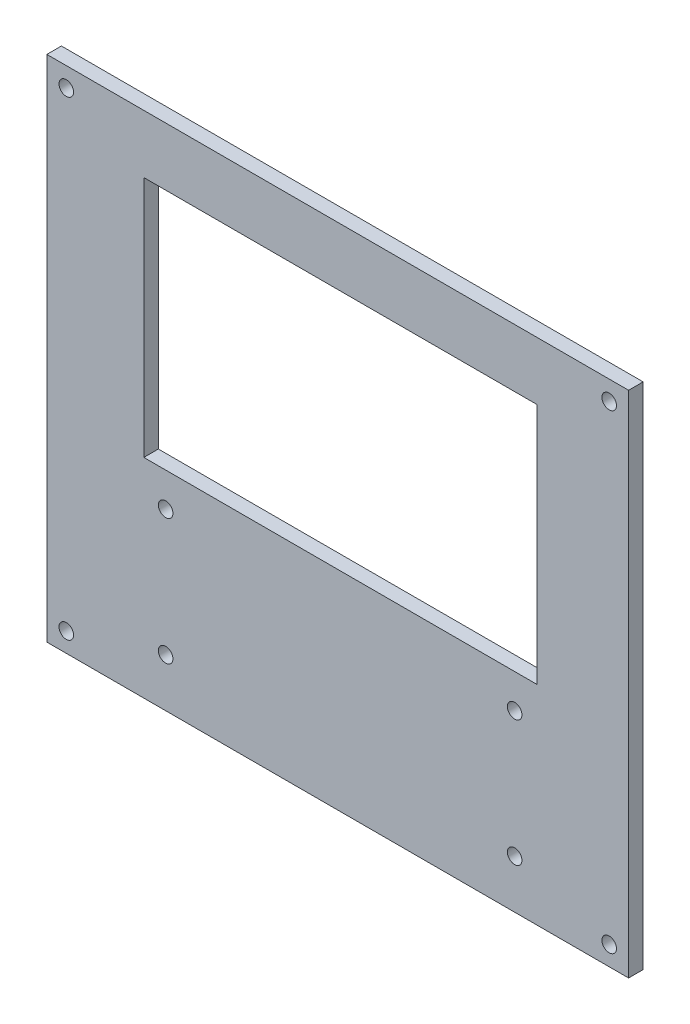
ISO-10303-21;
HEADER;
FILE_DESCRIPTION(('STEP AP214'),'2;1');
FILE_NAME('part.step','',(''),(''),'','','');
FILE_SCHEMA(('AUTOMOTIVE_DESIGN { 1 0 10303 214 1 1 1 1 }'));
ENDSEC;
DATA;
#1=APPLICATION_CONTEXT('core data for automotive mechanical design processes');
#2=APPLICATION_PROTOCOL_DEFINITION('international standard','automotive_design',2000,#1);
#3=PRODUCT_CONTEXT('',#1,'mechanical');
#4=PRODUCT('Part','Part','',(#3));
#5=PRODUCT_RELATED_PRODUCT_CATEGORY('part','',(#4));
#6=PRODUCT_DEFINITION_FORMATION('','',#4);
#7=PRODUCT_DEFINITION_CONTEXT('part definition',#1,'design');
#8=PRODUCT_DEFINITION('design','',#6,#7);
#9=PRODUCT_DEFINITION_SHAPE('','',#8);
#10=(LENGTH_UNIT() NAMED_UNIT(*) SI_UNIT(.MILLI.,.METRE.));
#11=(NAMED_UNIT(*) PLANE_ANGLE_UNIT() SI_UNIT($,.RADIAN.));
#12=(NAMED_UNIT(*) SI_UNIT($,.STERADIAN.) SOLID_ANGLE_UNIT());
#13=UNCERTAINTY_MEASURE_WITH_UNIT(LENGTH_MEASURE(1.E-05),#10,'distance_accuracy_value','');
#14=(GEOMETRIC_REPRESENTATION_CONTEXT(3) GLOBAL_UNCERTAINTY_ASSIGNED_CONTEXT((#13)) GLOBAL_UNIT_ASSIGNED_CONTEXT((#10,
#11,#12)) REPRESENTATION_CONTEXT('',''));
#15=CARTESIAN_POINT('',(0.,0.,0.));
#16=DIRECTION('',(0.,0.,1.));
#17=DIRECTION('',(1.,0.,0.));
#18=AXIS2_PLACEMENT_3D('',#15,#16,#17);
#19=CARTESIAN_POINT('',(60.,52.5,3.));
#20=DIRECTION('',(-1.,0.,0.));
#21=DIRECTION('',(0.,0.,1.));
#22=AXIS2_PLACEMENT_3D('',#19,#20,#21);
#23=PLANE('',#22);
#24=DIRECTION('',(0.,1.,0.));
#25=VECTOR('',#24,1.);
#26=CARTESIAN_POINT('',(60.,52.5,0.));
#27=LINE('',#26,#25);
#28=CARTESIAN_POINT('',(60.,-52.5,0.));
#29=VERTEX_POINT('',#28);
#30=CARTESIAN_POINT('',(60.,52.5,0.));
#31=VERTEX_POINT('',#30);
#32=EDGE_CURVE('E219',#29,#31,#27,.T.);
#33=ORIENTED_EDGE('',*,*,#32,.T.);
#34=DIRECTION('',(0.,0.,-1.));
#35=VECTOR('',#34,1.);
#36=CARTESIAN_POINT('',(60.,52.5,3.));
#37=LINE('',#36,#35);
#38=CARTESIAN_POINT('',(60.,52.5,3.));
#39=VERTEX_POINT('',#38);
#40=EDGE_CURVE('E11',#39,#31,#37,.T.);
#41=ORIENTED_EDGE('',*,*,#40,.F.);
#42=DIRECTION('',(0.,1.,0.));
#43=VECTOR('',#42,1.);
#44=CARTESIAN_POINT('',(60.,52.5,3.));
#45=LINE('',#44,#43);
#46=CARTESIAN_POINT('',(60.,-52.5,3.));
#47=VERTEX_POINT('',#46);
#48=EDGE_CURVE('E204',#47,#39,#45,.T.);
#49=ORIENTED_EDGE('',*,*,#48,.F.);
#50=DIRECTION('',(0.,0.,-1.));
#51=VECTOR('',#50,1.);
#52=CARTESIAN_POINT('',(60.,-52.5,3.));
#53=LINE('',#52,#51);
#54=EDGE_CURVE('E218',#47,#29,#53,.T.);
#55=ORIENTED_EDGE('',*,*,#54,.T.);
#56=EDGE_LOOP('',(#33,#41,#49,#55));
#57=FACE_BOUND('',#56,.T.);
#58=ADVANCED_FACE('F42',(#57),#23,.F.);
#59=CARTESIAN_POINT('',(-60.,52.5,3.));
#60=DIRECTION('',(0.,-1.,0.));
#61=DIRECTION('',(0.,0.,-1.));
#62=AXIS2_PLACEMENT_3D('',#59,#60,#61);
#63=PLANE('',#62);
#64=DIRECTION('',(-1.,0.,0.));
#65=VECTOR('',#64,1.);
#66=CARTESIAN_POINT('',(-60.,52.5,0.));
#67=LINE('',#66,#65);
#68=CARTESIAN_POINT('',(-60.,52.5,0.));
#69=VERTEX_POINT('',#68);
#70=EDGE_CURVE('E223',#31,#69,#67,.T.);
#71=ORIENTED_EDGE('',*,*,#70,.T.);
#72=DIRECTION('',(0.,0.,-1.));
#73=VECTOR('',#72,1.);
#74=CARTESIAN_POINT('',(-60.,52.5,3.));
#75=LINE('',#74,#73);
#76=CARTESIAN_POINT('',(-60.,52.5,3.));
#77=VERTEX_POINT('',#76);
#78=EDGE_CURVE('E51',#77,#69,#75,.T.);
#79=ORIENTED_EDGE('',*,*,#78,.F.);
#80=DIRECTION('',(-1.,0.,0.));
#81=VECTOR('',#80,1.);
#82=CARTESIAN_POINT('',(-60.,52.5,3.));
#83=LINE('',#82,#81);
#84=EDGE_CURVE('E208',#39,#77,#83,.T.);
#85=ORIENTED_EDGE('',*,*,#84,.F.);
#86=ORIENTED_EDGE('',*,*,#40,.T.);
#87=EDGE_LOOP('',(#71,#79,#85,#86));
#88=FACE_BOUND('',#87,.T.);
#89=ADVANCED_FACE('F275',(#88),#63,.F.);
#90=CARTESIAN_POINT('',(-60.,52.5,3.));
#91=DIRECTION('',(1.,0.,0.));
#92=DIRECTION('',(0.,0.,-1.));
#93=AXIS2_PLACEMENT_3D('',#90,#91,#92);
#94=PLANE('',#93);
#95=DIRECTION('',(0.,-1.,0.));
#96=VECTOR('',#95,1.);
#97=CARTESIAN_POINT('',(-60.,52.5,0.));
#98=LINE('',#97,#96);
#99=CARTESIAN_POINT('',(-60.,-52.5,0.));
#100=VERTEX_POINT('',#99);
#101=EDGE_CURVE('E226',#69,#100,#98,.T.);
#102=ORIENTED_EDGE('',*,*,#101,.T.);
#103=DIRECTION('',(0.,0.,-1.));
#104=VECTOR('',#103,1.);
#105=CARTESIAN_POINT('',(-60.,-52.5,3.));
#106=LINE('',#105,#104);
#107=CARTESIAN_POINT('',(-60.,-52.5,3.));
#108=VERTEX_POINT('',#107);
#109=EDGE_CURVE('E234',#108,#100,#106,.T.);
#110=ORIENTED_EDGE('',*,*,#109,.F.);
#111=DIRECTION('',(0.,-1.,0.));
#112=VECTOR('',#111,1.);
#113=CARTESIAN_POINT('',(-60.,52.5,3.));
#114=LINE('',#113,#112);
#115=EDGE_CURVE('E212',#77,#108,#114,.T.);
#116=ORIENTED_EDGE('',*,*,#115,.F.);
#117=ORIENTED_EDGE('',*,*,#78,.T.);
#118=EDGE_LOOP('',(#102,#110,#116,#117));
#119=FACE_BOUND('',#118,.T.);
#120=ADVANCED_FACE('F280',(#119),#94,.F.);
#121=CARTESIAN_POINT('',(-60.,-52.5,3.));
#122=DIRECTION('',(0.,1.,0.));
#123=DIRECTION('',(0.,0.,1.));
#124=AXIS2_PLACEMENT_3D('',#121,#122,#123);
#125=PLANE('',#124);
#126=DIRECTION('',(1.,0.,0.));
#127=VECTOR('',#126,1.);
#128=CARTESIAN_POINT('',(-60.,-52.5,0.));
#129=LINE('',#128,#127);
#130=EDGE_CURVE('E209',#100,#29,#129,.T.);
#131=ORIENTED_EDGE('',*,*,#130,.T.);
#132=ORIENTED_EDGE('',*,*,#54,.F.);
#133=DIRECTION('',(1.,0.,0.));
#134=VECTOR('',#133,1.);
#135=CARTESIAN_POINT('',(-60.,-52.5,3.));
#136=LINE('',#135,#134);
#137=EDGE_CURVE('E215',#108,#47,#136,.T.);
#138=ORIENTED_EDGE('',*,*,#137,.F.);
#139=ORIENTED_EDGE('',*,*,#109,.T.);
#140=EDGE_LOOP('',(#131,#132,#138,#139));
#141=FACE_BOUND('',#140,.T.);
#142=ADVANCED_FACE('F296',(#141),#125,.F.);
#143=CARTESIAN_POINT('',(0.,0.,3.));
#144=DIRECTION('',(0.,0.,1.));
#145=DIRECTION('',(1.,0.,0.));
#146=AXIS2_PLACEMENT_3D('',#143,#144,#145);
#147=PLANE('',#146);
#148=DIRECTION('',(0.,1.,0.));
#149=VECTOR('',#148,1.);
#150=CARTESIAN_POINT('',(41.1514469051066,0.,3.));
#151=LINE('',#150,#149);
#152=CARTESIAN_POINT('',(41.1514469051066,-9.50000000000001,3.));
#153=VERTEX_POINT('',#152);
#154=CARTESIAN_POINT('',(41.1514469051066,40.5,3.));
#155=VERTEX_POINT('',#154);
#156=EDGE_CURVE('E184',#153,#155,#151,.T.);
#157=ORIENTED_EDGE('',*,*,#156,.F.);
#158=DIRECTION('',(1.,0.,0.));
#159=VECTOR('',#158,1.);
#160=CARTESIAN_POINT('',(0.,-9.50000000000001,3.));
#161=LINE('',#160,#159);
#162=CARTESIAN_POINT('',(-40.,-9.50000000000001,3.));
#163=VERTEX_POINT('',#162);
#164=EDGE_CURVE('E176',#163,#153,#161,.T.);
#165=ORIENTED_EDGE('',*,*,#164,.F.);
#166=DIRECTION('',(0.,-1.,0.));
#167=VECTOR('',#166,1.);
#168=CARTESIAN_POINT('',(-40.,0.,3.));
#169=LINE('',#168,#167);
#170=CARTESIAN_POINT('',(-40.,40.5,3.));
#171=VERTEX_POINT('',#170);
#172=EDGE_CURVE('E115',#171,#163,#169,.T.);
#173=ORIENTED_EDGE('',*,*,#172,.F.);
#174=DIRECTION('',(-1.,0.,0.));
#175=VECTOR('',#174,1.);
#176=CARTESIAN_POINT('',(0.,40.5,3.));
#177=LINE('',#176,#175);
#178=EDGE_CURVE('E181',#155,#171,#177,.T.);
#179=ORIENTED_EDGE('',*,*,#178,.F.);
#180=EDGE_LOOP('',(#157,#165,#173,#179));
#181=FACE_BOUND('',#180,.T.);
#182=CARTESIAN_POINT('',(36.5,-42.5,3.));
#183=DIRECTION('',(0.,0.,1.));
#184=DIRECTION('',(1.,0.,0.));
#185=AXIS2_PLACEMENT_3D('',#182,#183,#184);
#186=CIRCLE('',#185,1.5);
#187=CARTESIAN_POINT('',(38.,-42.5,3.));
#188=VERTEX_POINT('',#187);
#189=EDGE_CURVE('E172',#188,#188,#186,.T.);
#190=ORIENTED_EDGE('',*,*,#189,.F.);
#191=EDGE_LOOP('',(#190));
#192=FACE_BOUND('',#191,.T.);
#193=CARTESIAN_POINT('',(-35.5,-42.5,3.));
#194=DIRECTION('',(0.,0.,1.));
#195=DIRECTION('',(1.,0.,0.));
#196=AXIS2_PLACEMENT_3D('',#193,#194,#195);
#197=CIRCLE('',#196,1.5);
#198=CARTESIAN_POINT('',(-34.,-42.5,3.));
#199=VERTEX_POINT('',#198);
#200=EDGE_CURVE('E168',#199,#199,#197,.T.);
#201=ORIENTED_EDGE('',*,*,#200,.F.);
#202=EDGE_LOOP('',(#201));
#203=FACE_BOUND('',#202,.T.);
#204=CARTESIAN_POINT('',(36.5,-16.5,3.));
#205=DIRECTION('',(0.,0.,1.));
#206=DIRECTION('',(1.,0.,0.));
#207=AXIS2_PLACEMENT_3D('',#204,#205,#206);
#208=CIRCLE('',#207,1.5);
#209=CARTESIAN_POINT('',(38.,-16.5,3.));
#210=VERTEX_POINT('',#209);
#211=EDGE_CURVE('E164',#210,#210,#208,.T.);
#212=ORIENTED_EDGE('',*,*,#211,.F.);
#213=EDGE_LOOP('',(#212));
#214=FACE_BOUND('',#213,.T.);
#215=CARTESIAN_POINT('',(-35.5,-16.5,3.));
#216=DIRECTION('',(0.,0.,1.));
#217=DIRECTION('',(1.,0.,0.));
#218=AXIS2_PLACEMENT_3D('',#215,#216,#217);
#219=CIRCLE('',#218,1.5);
#220=CARTESIAN_POINT('',(-34.,-16.5,3.));
#221=VERTEX_POINT('',#220);
#222=EDGE_CURVE('E140',#221,#221,#219,.T.);
#223=ORIENTED_EDGE('',*,*,#222,.F.);
#224=EDGE_LOOP('',(#223));
#225=FACE_BOUND('',#224,.T.);
#226=CARTESIAN_POINT('',(-56.,-48.5,3.));
#227=DIRECTION('',(0.,0.,1.));
#228=DIRECTION('',(-1.,0.,0.));
#229=AXIS2_PLACEMENT_3D('',#226,#227,#228);
#230=CIRCLE('',#229,1.5);
#231=CARTESIAN_POINT('',(-57.5,-48.5,3.));
#232=VERTEX_POINT('',#231);
#233=EDGE_CURVE('E187',#232,#232,#230,.T.);
#234=ORIENTED_EDGE('',*,*,#233,.F.);
#235=EDGE_LOOP('',(#234));
#236=FACE_BOUND('',#235,.T.);
#237=CARTESIAN_POINT('',(56.,-48.5,3.));
#238=DIRECTION('',(0.,0.,1.));
#239=DIRECTION('',(1.,0.,0.));
#240=AXIS2_PLACEMENT_3D('',#237,#238,#239);
#241=CIRCLE('',#240,1.49999999999999);
#242=CARTESIAN_POINT('',(57.5,-48.5,3.));
#243=VERTEX_POINT('',#242);
#244=EDGE_CURVE('E193',#243,#243,#241,.T.);
#245=ORIENTED_EDGE('',*,*,#244,.F.);
#246=EDGE_LOOP('',(#245));
#247=FACE_BOUND('',#246,.T.);
#248=CARTESIAN_POINT('',(56.,48.5,3.));
#249=DIRECTION('',(0.,0.,1.));
#250=DIRECTION('',(-1.,0.,0.));
#251=AXIS2_PLACEMENT_3D('',#248,#249,#250);
#252=CIRCLE('',#251,1.49999999999999);
#253=CARTESIAN_POINT('',(54.5,48.5,3.));
#254=VERTEX_POINT('',#253);
#255=EDGE_CURVE('E188',#254,#254,#252,.T.);
#256=ORIENTED_EDGE('',*,*,#255,.F.);
#257=EDGE_LOOP('',(#256));
#258=FACE_BOUND('',#257,.T.);
#259=CARTESIAN_POINT('',(-56.,48.5,3.));
#260=DIRECTION('',(0.,0.,1.));
#261=DIRECTION('',(1.,0.,0.));
#262=AXIS2_PLACEMENT_3D('',#259,#260,#261);
#263=CIRCLE('',#262,1.5);
#264=CARTESIAN_POINT('',(-54.5,48.5,3.));
#265=VERTEX_POINT('',#264);
#266=EDGE_CURVE('E192',#265,#265,#263,.T.);
#267=ORIENTED_EDGE('',*,*,#266,.F.);
#268=EDGE_LOOP('',(#267));
#269=FACE_BOUND('',#268,.T.);
#270=ORIENTED_EDGE('',*,*,#48,.T.);
#271=ORIENTED_EDGE('',*,*,#84,.T.);
#272=ORIENTED_EDGE('',*,*,#115,.T.);
#273=ORIENTED_EDGE('',*,*,#137,.T.);
#274=EDGE_LOOP('',(#270,#271,#272,#273));
#275=FACE_BOUND('',#274,.T.);
#276=ADVANCED_FACE('F292',(#181,#192,#203,#214,#225,#236,#247,#258,#269,#275),#147,.T.);
#277=CARTESIAN_POINT('',(0.,0.,0.));
#278=DIRECTION('',(0.,0.,1.));
#279=DIRECTION('',(1.,0.,0.));
#280=AXIS2_PLACEMENT_3D('',#277,#278,#279);
#281=PLANE('',#280);
#282=DIRECTION('',(-1.,0.,0.));
#283=VECTOR('',#282,1.);
#284=CARTESIAN_POINT('',(41.1514469051066,-9.50000000000001,0.));
#285=LINE('',#284,#283);
#286=CARTESIAN_POINT('',(41.1514469051066,-9.50000000000001,0.));
#287=VERTEX_POINT('',#286);
#288=CARTESIAN_POINT('',(-40.,-9.50000000000001,0.));
#289=VERTEX_POINT('',#288);
#290=EDGE_CURVE('E122',#287,#289,#285,.T.);
#291=ORIENTED_EDGE('',*,*,#290,.F.);
#292=DIRECTION('',(0.,-1.,0.));
#293=VECTOR('',#292,1.);
#294=CARTESIAN_POINT('',(41.1514469051066,40.5,0.));
#295=LINE('',#294,#293);
#296=CARTESIAN_POINT('',(41.1514469051066,40.5,0.));
#297=VERTEX_POINT('',#296);
#298=EDGE_CURVE('E67',#297,#287,#295,.T.);
#299=ORIENTED_EDGE('',*,*,#298,.F.);
#300=DIRECTION('',(1.,0.,0.));
#301=VECTOR('',#300,1.);
#302=CARTESIAN_POINT('',(41.1514469051066,40.5,0.));
#303=LINE('',#302,#301);
#304=CARTESIAN_POINT('',(-40.,40.5,0.));
#305=VERTEX_POINT('',#304);
#306=EDGE_CURVE('E130',#305,#297,#303,.T.);
#307=ORIENTED_EDGE('',*,*,#306,.F.);
#308=DIRECTION('',(0.,1.,0.));
#309=VECTOR('',#308,1.);
#310=CARTESIAN_POINT('',(-40.,40.5,0.));
#311=LINE('',#310,#309);
#312=EDGE_CURVE('E112',#289,#305,#311,.T.);
#313=ORIENTED_EDGE('',*,*,#312,.F.);
#314=EDGE_LOOP('',(#291,#299,#307,#313));
#315=FACE_BOUND('',#314,.T.);
#316=CARTESIAN_POINT('',(36.5,-42.5,0.));
#317=DIRECTION('',(0.,0.,-1.));
#318=DIRECTION('',(-1.,0.,0.));
#319=AXIS2_PLACEMENT_3D('',#316,#317,#318);
#320=CIRCLE('',#319,1.5);
#321=CARTESIAN_POINT('',(35.,-42.5,0.));
#322=VERTEX_POINT('',#321);
#323=EDGE_CURVE('E145',#322,#322,#320,.T.);
#324=ORIENTED_EDGE('',*,*,#323,.F.);
#325=EDGE_LOOP('',(#324));
#326=FACE_BOUND('',#325,.T.);
#327=CARTESIAN_POINT('',(-35.5,-42.5,0.));
#328=DIRECTION('',(0.,0.,-1.));
#329=DIRECTION('',(-1.,0.,0.));
#330=AXIS2_PLACEMENT_3D('',#327,#328,#329);
#331=CIRCLE('',#330,1.5);
#332=CARTESIAN_POINT('',(-37.,-42.5,0.));
#333=VERTEX_POINT('',#332);
#334=EDGE_CURVE('E149',#333,#333,#331,.T.);
#335=ORIENTED_EDGE('',*,*,#334,.F.);
#336=EDGE_LOOP('',(#335));
#337=FACE_BOUND('',#336,.T.);
#338=CARTESIAN_POINT('',(36.5,-16.5,0.));
#339=DIRECTION('',(0.,0.,-1.));
#340=DIRECTION('',(-1.,0.,0.));
#341=AXIS2_PLACEMENT_3D('',#338,#339,#340);
#342=CIRCLE('',#341,1.5);
#343=CARTESIAN_POINT('',(35.,-16.5,0.));
#344=VERTEX_POINT('',#343);
#345=EDGE_CURVE('E153',#344,#344,#342,.T.);
#346=ORIENTED_EDGE('',*,*,#345,.F.);
#347=EDGE_LOOP('',(#346));
#348=FACE_BOUND('',#347,.T.);
#349=CARTESIAN_POINT('',(-35.5,-16.5,0.));
#350=DIRECTION('',(0.,0.,-1.));
#351=DIRECTION('',(-1.,0.,0.));
#352=AXIS2_PLACEMENT_3D('',#349,#350,#351);
#353=CIRCLE('',#352,1.5);
#354=CARTESIAN_POINT('',(-37.,-16.5,0.));
#355=VERTEX_POINT('',#354);
#356=EDGE_CURVE('E157',#355,#355,#353,.T.);
#357=ORIENTED_EDGE('',*,*,#356,.F.);
#358=EDGE_LOOP('',(#357));
#359=FACE_BOUND('',#358,.T.);
#360=CARTESIAN_POINT('',(-56.,-48.5,0.));
#361=DIRECTION('',(0.,0.,1.));
#362=DIRECTION('',(1.,0.,0.));
#363=AXIS2_PLACEMENT_3D('',#360,#361,#362);
#364=CIRCLE('',#363,1.5);
#365=CARTESIAN_POINT('',(-54.5,-48.5,0.));
#366=VERTEX_POINT('',#365);
#367=EDGE_CURVE('E45',#366,#366,#364,.T.);
#368=ORIENTED_EDGE('',*,*,#367,.T.);
#369=EDGE_LOOP('',(#368));
#370=FACE_BOUND('',#369,.T.);
#371=CARTESIAN_POINT('',(56.,-48.5,0.));
#372=DIRECTION('',(0.,0.,1.));
#373=DIRECTION('',(1.,0.,0.));
#374=AXIS2_PLACEMENT_3D('',#371,#372,#373);
#375=CIRCLE('',#374,1.49999999999999);
#376=CARTESIAN_POINT('',(57.5,-48.5,0.));
#377=VERTEX_POINT('',#376);
#378=EDGE_CURVE('E247',#377,#377,#375,.T.);
#379=ORIENTED_EDGE('',*,*,#378,.T.);
#380=EDGE_LOOP('',(#379));
#381=FACE_BOUND('',#380,.T.);
#382=CARTESIAN_POINT('',(56.,48.5,0.));
#383=DIRECTION('',(0.,0.,1.));
#384=DIRECTION('',(1.,0.,0.));
#385=AXIS2_PLACEMENT_3D('',#382,#383,#384);
#386=CIRCLE('',#385,1.49999999999999);
#387=CARTESIAN_POINT('',(57.5,48.5,0.));
#388=VERTEX_POINT('',#387);
#389=EDGE_CURVE('E244',#388,#388,#386,.T.);
#390=ORIENTED_EDGE('',*,*,#389,.T.);
#391=EDGE_LOOP('',(#390));
#392=FACE_BOUND('',#391,.T.);
#393=CARTESIAN_POINT('',(-56.,48.5,0.));
#394=DIRECTION('',(0.,0.,1.));
#395=DIRECTION('',(1.,0.,0.));
#396=AXIS2_PLACEMENT_3D('',#393,#394,#395);
#397=CIRCLE('',#396,1.5);
#398=CARTESIAN_POINT('',(-54.5,48.5,0.));
#399=VERTEX_POINT('',#398);
#400=EDGE_CURVE('E203',#399,#399,#397,.T.);
#401=ORIENTED_EDGE('',*,*,#400,.T.);
#402=EDGE_LOOP('',(#401));
#403=FACE_BOUND('',#402,.T.);
#404=ORIENTED_EDGE('',*,*,#32,.F.);
#405=ORIENTED_EDGE('',*,*,#130,.F.);
#406=ORIENTED_EDGE('',*,*,#101,.F.);
#407=ORIENTED_EDGE('',*,*,#70,.F.);
#408=EDGE_LOOP('',(#404,#405,#406,#407));
#409=FACE_BOUND('',#408,.T.);
#410=ADVANCED_FACE('F127',(#315,#326,#337,#348,#359,#370,#381,#392,#403,#409),#281,.F.);
#411=CARTESIAN_POINT('',(-56.,48.5,-7.));
#412=DIRECTION('',(0.,0.,1.));
#413=DIRECTION('',(1.,0.,0.));
#414=AXIS2_PLACEMENT_3D('',#411,#412,#413);
#415=CYLINDRICAL_SURFACE('',#414,1.5);
#416=ORIENTED_EDGE('',*,*,#266,.T.);
#417=EDGE_LOOP('',(#416));
#418=FACE_BOUND('',#417,.T.);
#419=ORIENTED_EDGE('',*,*,#400,.F.);
#420=EDGE_LOOP('',(#419));
#421=FACE_BOUND('',#420,.T.);
#422=ADVANCED_FACE('F307',(#418,#421),#415,.F.);
#423=CARTESIAN_POINT('',(56.,48.5,-7.));
#424=DIRECTION('',(0.,0.,1.));
#425=DIRECTION('',(1.,0.,0.));
#426=AXIS2_PLACEMENT_3D('',#423,#424,#425);
#427=CYLINDRICAL_SURFACE('',#426,1.49999999999999);
#428=ORIENTED_EDGE('',*,*,#255,.T.);
#429=EDGE_LOOP('',(#428));
#430=FACE_BOUND('',#429,.T.);
#431=ORIENTED_EDGE('',*,*,#389,.F.);
#432=EDGE_LOOP('',(#431));
#433=FACE_BOUND('',#432,.T.);
#434=ADVANCED_FACE('F270',(#430,#433),#427,.F.);
#435=CARTESIAN_POINT('',(56.,-48.5,-7.));
#436=DIRECTION('',(0.,0.,1.));
#437=DIRECTION('',(1.,0.,0.));
#438=AXIS2_PLACEMENT_3D('',#435,#436,#437);
#439=CYLINDRICAL_SURFACE('',#438,1.49999999999999);
#440=ORIENTED_EDGE('',*,*,#244,.T.);
#441=EDGE_LOOP('',(#440));
#442=FACE_BOUND('',#441,.T.);
#443=ORIENTED_EDGE('',*,*,#378,.F.);
#444=EDGE_LOOP('',(#443));
#445=FACE_BOUND('',#444,.T.);
#446=ADVANCED_FACE('F260',(#442,#445),#439,.F.);
#447=CARTESIAN_POINT('',(-56.,-48.5,-7.));
#448=DIRECTION('',(0.,0.,1.));
#449=DIRECTION('',(1.,0.,0.));
#450=AXIS2_PLACEMENT_3D('',#447,#448,#449);
#451=CYLINDRICAL_SURFACE('',#450,1.5);
#452=ORIENTED_EDGE('',*,*,#233,.T.);
#453=EDGE_LOOP('',(#452));
#454=FACE_BOUND('',#453,.T.);
#455=ORIENTED_EDGE('',*,*,#367,.F.);
#456=EDGE_LOOP('',(#455));
#457=FACE_BOUND('',#456,.T.);
#458=ADVANCED_FACE('F257',(#454,#457),#451,.F.);
#459=CARTESIAN_POINT('',(-35.5,-16.5,10.));
#460=DIRECTION('',(0.,0.,-1.));
#461=DIRECTION('',(-1.,0.,0.));
#462=AXIS2_PLACEMENT_3D('',#459,#460,#461);
#463=CYLINDRICAL_SURFACE('',#462,1.5);
#464=ORIENTED_EDGE('',*,*,#222,.T.);
#465=EDGE_LOOP('',(#464));
#466=FACE_BOUND('',#465,.T.);
#467=ORIENTED_EDGE('',*,*,#356,.T.);
#468=EDGE_LOOP('',(#467));
#469=FACE_BOUND('',#468,.T.);
#470=ADVANCED_FACE('F259',(#466,#469),#463,.F.);
#471=CARTESIAN_POINT('',(36.5,-16.5,10.));
#472=DIRECTION('',(0.,0.,-1.));
#473=DIRECTION('',(-1.,0.,0.));
#474=AXIS2_PLACEMENT_3D('',#471,#472,#473);
#475=CYLINDRICAL_SURFACE('',#474,1.5);
#476=ORIENTED_EDGE('',*,*,#211,.T.);
#477=EDGE_LOOP('',(#476));
#478=FACE_BOUND('',#477,.T.);
#479=ORIENTED_EDGE('',*,*,#345,.T.);
#480=EDGE_LOOP('',(#479));
#481=FACE_BOUND('',#480,.T.);
#482=ADVANCED_FACE('F267',(#478,#481),#475,.F.);
#483=CARTESIAN_POINT('',(-35.5,-42.5,10.));
#484=DIRECTION('',(0.,0.,-1.));
#485=DIRECTION('',(-1.,0.,0.));
#486=AXIS2_PLACEMENT_3D('',#483,#484,#485);
#487=CYLINDRICAL_SURFACE('',#486,1.5);
#488=ORIENTED_EDGE('',*,*,#200,.T.);
#489=EDGE_LOOP('',(#488));
#490=FACE_BOUND('',#489,.T.);
#491=ORIENTED_EDGE('',*,*,#334,.T.);
#492=EDGE_LOOP('',(#491));
#493=FACE_BOUND('',#492,.T.);
#494=ADVANCED_FACE('F329',(#490,#493),#487,.F.);
#495=CARTESIAN_POINT('',(36.5,-42.5,10.));
#496=DIRECTION('',(0.,0.,-1.));
#497=DIRECTION('',(-1.,0.,0.));
#498=AXIS2_PLACEMENT_3D('',#495,#496,#497);
#499=CYLINDRICAL_SURFACE('',#498,1.5);
#500=ORIENTED_EDGE('',*,*,#189,.T.);
#501=EDGE_LOOP('',(#500));
#502=FACE_BOUND('',#501,.T.);
#503=ORIENTED_EDGE('',*,*,#323,.T.);
#504=EDGE_LOOP('',(#503));
#505=FACE_BOUND('',#504,.T.);
#506=ADVANCED_FACE('F333',(#502,#505),#499,.F.);
#507=CARTESIAN_POINT('',(41.1514469051066,40.5,10.));
#508=DIRECTION('',(1.,0.,0.));
#509=DIRECTION('',(0.,0.,-1.));
#510=AXIS2_PLACEMENT_3D('',#507,#508,#509);
#511=PLANE('',#510);
#512=ORIENTED_EDGE('',*,*,#156,.T.);
#513=DIRECTION('',(0.,0.,-1.));
#514=VECTOR('',#513,1.);
#515=CARTESIAN_POINT('',(41.1514469051066,40.5,10.));
#516=LINE('',#515,#514);
#517=EDGE_CURVE('E137',#155,#297,#516,.T.);
#518=ORIENTED_EDGE('',*,*,#517,.T.);
#519=ORIENTED_EDGE('',*,*,#298,.T.);
#520=DIRECTION('',(0.,0.,-1.));
#521=VECTOR('',#520,1.);
#522=CARTESIAN_POINT('',(41.1514469051066,-9.50000000000001,10.));
#523=LINE('',#522,#521);
#524=EDGE_CURVE('E119',#153,#287,#523,.T.);
#525=ORIENTED_EDGE('',*,*,#524,.F.);
#526=EDGE_LOOP('',(#512,#518,#519,#525));
#527=FACE_BOUND('',#526,.T.);
#528=ADVANCED_FACE('F337',(#527),#511,.F.);
#529=CARTESIAN_POINT('',(41.1514469051066,40.5,10.));
#530=DIRECTION('',(0.,1.,0.));
#531=DIRECTION('',(0.,0.,1.));
#532=AXIS2_PLACEMENT_3D('',#529,#530,#531);
#533=PLANE('',#532);
#534=ORIENTED_EDGE('',*,*,#178,.T.);
#535=DIRECTION('',(0.,0.,-1.));
#536=VECTOR('',#535,1.);
#537=CARTESIAN_POINT('',(-40.,40.5,10.));
#538=LINE('',#537,#536);
#539=EDGE_CURVE('E118',#171,#305,#538,.T.);
#540=ORIENTED_EDGE('',*,*,#539,.T.);
#541=ORIENTED_EDGE('',*,*,#306,.T.);
#542=ORIENTED_EDGE('',*,*,#517,.F.);
#543=EDGE_LOOP('',(#534,#540,#541,#542));
#544=FACE_BOUND('',#543,.T.);
#545=ADVANCED_FACE('F341',(#544),#533,.F.);
#546=CARTESIAN_POINT('',(-40.,40.5,10.));
#547=DIRECTION('',(-1.,0.,0.));
#548=DIRECTION('',(0.,0.,1.));
#549=AXIS2_PLACEMENT_3D('',#546,#547,#548);
#550=PLANE('',#549);
#551=ORIENTED_EDGE('',*,*,#172,.T.);
#552=DIRECTION('',(0.,0.,-1.));
#553=VECTOR('',#552,1.);
#554=CARTESIAN_POINT('',(-40.,-9.50000000000001,10.));
#555=LINE('',#554,#553);
#556=EDGE_CURVE('E59',#163,#289,#555,.T.);
#557=ORIENTED_EDGE('',*,*,#556,.T.);
#558=ORIENTED_EDGE('',*,*,#312,.T.);
#559=ORIENTED_EDGE('',*,*,#539,.F.);
#560=EDGE_LOOP('',(#551,#557,#558,#559));
#561=FACE_BOUND('',#560,.T.);
#562=ADVANCED_FACE('F109',(#561),#550,.F.);
#563=CARTESIAN_POINT('',(41.1514469051066,-9.50000000000001,10.));
#564=DIRECTION('',(0.,-1.,0.));
#565=DIRECTION('',(0.,0.,-1.));
#566=AXIS2_PLACEMENT_3D('',#563,#564,#565);
#567=PLANE('',#566);
#568=ORIENTED_EDGE('',*,*,#164,.T.);
#569=ORIENTED_EDGE('',*,*,#524,.T.);
#570=ORIENTED_EDGE('',*,*,#290,.T.);
#571=ORIENTED_EDGE('',*,*,#556,.F.);
#572=EDGE_LOOP('',(#568,#569,#570,#571));
#573=FACE_BOUND('',#572,.T.);
#574=ADVANCED_FACE('F123',(#573),#567,.F.);
#575=CLOSED_SHELL('',(#58,#89,#120,#142,#276,#410,#422,#434,#446,#458,#470,#482,#494,#506,#528,
#545,#562,#574));
#576=MANIFOLD_SOLID_BREP('B2',#575);
#577=ADVANCED_BREP_SHAPE_REPRESENTATION('',(#18,#576),#14);
#578=SHAPE_DEFINITION_REPRESENTATION(#9,#577);
ENDSEC;
END-ISO-10303-21;
